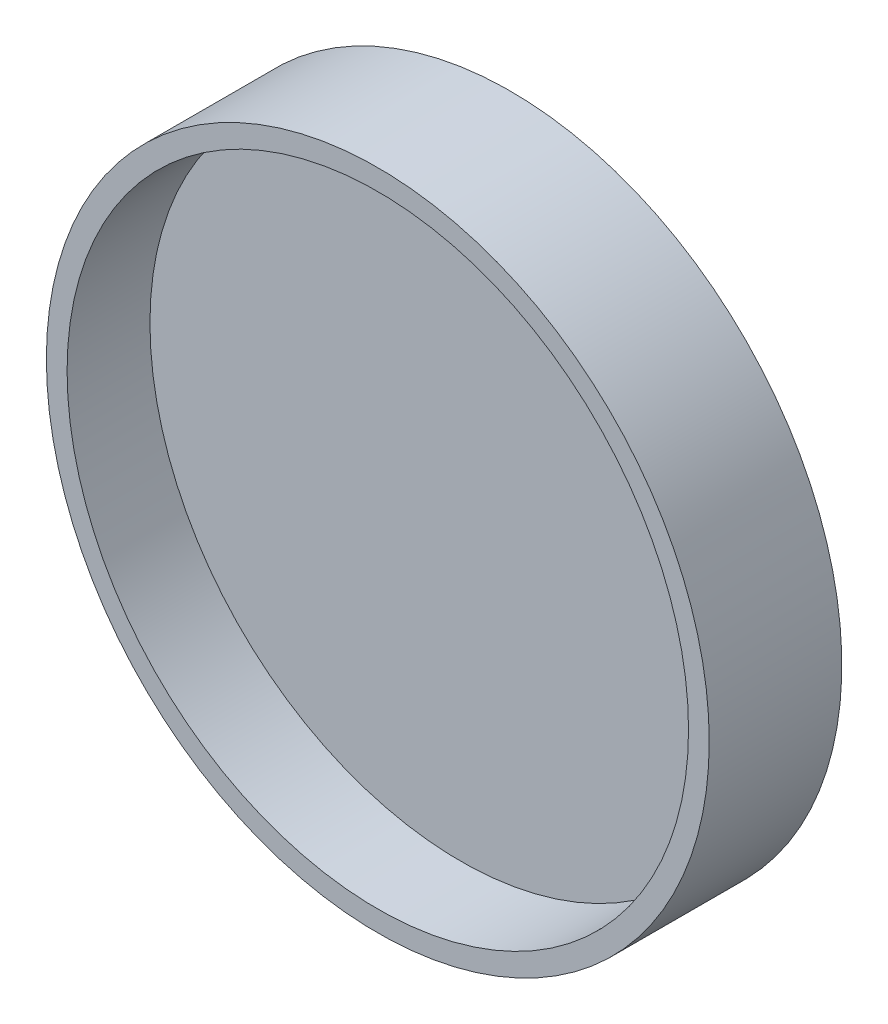
ISO-10303-21;
HEADER;
FILE_DESCRIPTION(('STEP AP214'),'2;1');
FILE_NAME('part.step','',(''),(''),'','','');
FILE_SCHEMA(('AUTOMOTIVE_DESIGN { 1 0 10303 214 1 1 1 1 }'));
ENDSEC;
DATA;
#1=APPLICATION_CONTEXT('core data for automotive mechanical design processes');
#2=APPLICATION_PROTOCOL_DEFINITION('international standard','automotive_design',2000,#1);
#3=PRODUCT_CONTEXT('',#1,'mechanical');
#4=PRODUCT('Part','Part','',(#3));
#5=PRODUCT_RELATED_PRODUCT_CATEGORY('part','',(#4));
#6=PRODUCT_DEFINITION_FORMATION('','',#4);
#7=PRODUCT_DEFINITION_CONTEXT('part definition',#1,'design');
#8=PRODUCT_DEFINITION('design','',#6,#7);
#9=PRODUCT_DEFINITION_SHAPE('','',#8);
#10=(LENGTH_UNIT() NAMED_UNIT(*) SI_UNIT(.MILLI.,.METRE.));
#11=(NAMED_UNIT(*) PLANE_ANGLE_UNIT() SI_UNIT($,.RADIAN.));
#12=(NAMED_UNIT(*) SI_UNIT($,.STERADIAN.) SOLID_ANGLE_UNIT());
#13=UNCERTAINTY_MEASURE_WITH_UNIT(LENGTH_MEASURE(1.E-05),#10,'distance_accuracy_value','');
#14=(GEOMETRIC_REPRESENTATION_CONTEXT(3) GLOBAL_UNCERTAINTY_ASSIGNED_CONTEXT((#13)) GLOBAL_UNIT_ASSIGNED_CONTEXT((#10,
#11,#12)) REPRESENTATION_CONTEXT('',''));
#15=CARTESIAN_POINT('',(0.,0.,0.));
#16=DIRECTION('',(0.,0.,1.));
#17=DIRECTION('',(1.,0.,0.));
#18=AXIS2_PLACEMENT_3D('',#15,#16,#17);
#19=CARTESIAN_POINT('',(0.,0.,-22.));
#20=DIRECTION('',(0.,0.,-1.));
#21=DIRECTION('',(-1.,0.,0.));
#22=AXIS2_PLACEMENT_3D('',#19,#20,#21);
#23=PLANE('',#22);
#24=CARTESIAN_POINT('',(0.,0.,-22.));
#25=DIRECTION('',(0.,0.,-1.));
#26=DIRECTION('',(-1.,0.,0.));
#27=AXIS2_PLACEMENT_3D('',#24,#25,#26);
#28=CIRCLE('',#27,13.9951171939745);
#29=CARTESIAN_POINT('',(-13.9951171939745,0.,-22.));
#30=VERTEX_POINT('',#29);
#31=EDGE_CURVE('E93',#30,#30,#28,.T.);
#32=ORIENTED_EDGE('',*,*,#31,.F.);
#33=EDGE_LOOP('',(#32));
#34=FACE_BOUND('',#33,.T.);
#35=CARTESIAN_POINT('',(0.,0.,-22.));
#36=DIRECTION('',(0.,0.,-1.));
#37=DIRECTION('',(-1.,0.,0.));
#38=AXIS2_PLACEMENT_3D('',#35,#36,#37);
#39=CIRCLE('',#38,34.425);
#40=CARTESIAN_POINT('',(-34.425,0.,-22.));
#41=VERTEX_POINT('',#40);
#42=EDGE_CURVE('E255',#41,#41,#39,.T.);
#43=ORIENTED_EDGE('',*,*,#42,.T.);
#44=EDGE_LOOP('',(#43));
#45=FACE_BOUND('',#44,.T.);
#46=ADVANCED_FACE('F54',(#34,#45),#23,.T.);
#47=CARTESIAN_POINT('',(0.,0.,-22.));
#48=DIRECTION('',(0.,0.,-1.));
#49=DIRECTION('',(-1.,0.,0.));
#50=AXIS2_PLACEMENT_3D('',#47,#48,#49);
#51=CONICAL_SURFACE('',#50,13.9951171939745,1.0471975511966);
#52=CARTESIAN_POINT('',(0.,0.,-20.04));
#53=DIRECTION('',(0.,0.,-1.));
#54=DIRECTION('',(-1.,0.,0.));
#55=AXIS2_PLACEMENT_3D('',#52,#53,#54);
#56=CIRCLE('',#55,10.6002976111395);
#57=CARTESIAN_POINT('',(-10.6002976111395,0.,-20.04));
#58=VERTEX_POINT('',#57);
#59=EDGE_CURVE('E83',#58,#58,#56,.T.);
#60=ORIENTED_EDGE('',*,*,#59,.F.);
#61=EDGE_LOOP('',(#60));
#62=FACE_BOUND('',#61,.T.);
#63=ORIENTED_EDGE('',*,*,#31,.T.);
#64=EDGE_LOOP('',(#63));
#65=FACE_BOUND('',#64,.T.);
#66=ADVANCED_FACE('F128',(#62,#65),#51,.F.);
#67=CARTESIAN_POINT('',(0.,0.,-20.04));
#68=DIRECTION('',(0.,0.,-1.));
#69=DIRECTION('',(-1.,0.,0.));
#70=AXIS2_PLACEMENT_3D('',#67,#68,#69);
#71=CONICAL_SURFACE('',#70,10.6002976111395,0.5235987755983);
#72=CARTESIAN_POINT('',(0.,0.,-10.3399999999999));
#73=DIRECTION('',(0.,0.,-1.));
#74=DIRECTION('',(-1.,0.,0.));
#75=AXIS2_PLACEMENT_3D('',#72,#73,#74);
#76=CIRCLE('',#75,5.);
#77=CARTESIAN_POINT('',(-5.,0.,-10.3399999999999));
#78=VERTEX_POINT('',#77);
#79=EDGE_CURVE('E76',#78,#78,#76,.T.);
#80=ORIENTED_EDGE('',*,*,#79,.F.);
#81=EDGE_LOOP('',(#80));
#82=FACE_BOUND('',#81,.T.);
#83=ORIENTED_EDGE('',*,*,#59,.T.);
#84=EDGE_LOOP('',(#83));
#85=FACE_BOUND('',#84,.T.);
#86=ADVANCED_FACE('F134',(#82,#85),#71,.F.);
#87=CARTESIAN_POINT('',(0.,0.,0.));
#88=DIRECTION('',(0.,0.,-1.));
#89=DIRECTION('',(-1.,0.,0.));
#90=AXIS2_PLACEMENT_3D('',#87,#88,#89);
#91=CYLINDRICAL_SURFACE('',#90,5.);
#92=CARTESIAN_POINT('',(0.,0.,2.46000000000011));
#93=DIRECTION('',(0.,0.,-1.));
#94=DIRECTION('',(-1.,0.,0.));
#95=AXIS2_PLACEMENT_3D('',#92,#93,#94);
#96=CIRCLE('',#95,5.);
#97=CARTESIAN_POINT('',(-5.,0.,2.46000000000011));
#98=VERTEX_POINT('',#97);
#99=EDGE_CURVE('E73',#98,#98,#96,.T.);
#100=ORIENTED_EDGE('',*,*,#99,.F.);
#101=EDGE_LOOP('',(#100));
#102=FACE_BOUND('',#101,.T.);
#103=ORIENTED_EDGE('',*,*,#79,.T.);
#104=EDGE_LOOP('',(#103));
#105=FACE_BOUND('',#104,.T.);
#106=ADVANCED_FACE('F69',(#102,#105),#91,.F.);
#107=CARTESIAN_POINT('',(0.,0.,2.46000000000011));
#108=DIRECTION('',(0.,0.,-1.));
#109=DIRECTION('',(-1.,0.,0.));
#110=AXIS2_PLACEMENT_3D('',#107,#108,#109);
#111=CONICAL_SURFACE('',#110,5.,0.785398163397438);
#112=CARTESIAN_POINT('',(0.,0.,7.46000000000015));
#113=VERTEX_POINT('',#112);
#114=VERTEX_LOOP('',#113);
#115=FACE_BOUND('',#114,.T.);
#116=ORIENTED_EDGE('',*,*,#99,.T.);
#117=EDGE_LOOP('',(#116));
#118=FACE_BOUND('',#117,.T.);
#119=ADVANCED_FACE('F65',(#115,#118),#111,.F.);
#120=CARTESIAN_POINT('',(0.,0.,-2.));
#121=DIRECTION('',(0.,0.,-1.));
#122=DIRECTION('',(-1.,0.,0.));
#123=AXIS2_PLACEMENT_3D('',#120,#121,#122);
#124=PLANE('',#123);
#125=CARTESIAN_POINT('',(0.,0.,-2.));
#126=DIRECTION('',(0.,0.,-1.));
#127=DIRECTION('',(-1.,0.,0.));
#128=AXIS2_PLACEMENT_3D('',#125,#126,#127);
#129=CIRCLE('',#128,34.425);
#130=CARTESIAN_POINT('',(-34.425,0.,-2.));
#131=VERTEX_POINT('',#130);
#132=EDGE_CURVE('E86',#131,#131,#129,.T.);
#133=ORIENTED_EDGE('',*,*,#132,.F.);
#134=EDGE_LOOP('',(#133));
#135=FACE_BOUND('',#134,.T.);
#136=CARTESIAN_POINT('',(0.,0.,-2.));
#137=DIRECTION('',(0.,0.,-1.));
#138=DIRECTION('',(-1.,0.,0.));
#139=AXIS2_PLACEMENT_3D('',#136,#137,#138);
#140=CIRCLE('',#139,80.);
#141=CARTESIAN_POINT('',(-80.,0.,-2.));
#142=VERTEX_POINT('',#141);
#143=EDGE_CURVE('E77',#142,#142,#140,.T.);
#144=ORIENTED_EDGE('',*,*,#143,.T.);
#145=EDGE_LOOP('',(#144));
#146=FACE_BOUND('',#145,.T.);
#147=ADVANCED_FACE('F68',(#135,#146),#124,.T.);
#148=CARTESIAN_POINT('',(0.,0.,-2.));
#149=DIRECTION('',(0.,0.,-1.));
#150=DIRECTION('',(-1.,0.,0.));
#151=AXIS2_PLACEMENT_3D('',#148,#149,#150);
#152=CYLINDRICAL_SURFACE('',#151,34.425);
#153=ORIENTED_EDGE('',*,*,#132,.T.);
#154=EDGE_LOOP('',(#153));
#155=FACE_BOUND('',#154,.T.);
#156=ORIENTED_EDGE('',*,*,#42,.F.);
#157=EDGE_LOOP('',(#156));
#158=FACE_BOUND('',#157,.T.);
#159=ADVANCED_FACE('F117',(#155,#158),#152,.T.);
#160=CARTESIAN_POINT('',(0.,0.,10.));
#161=DIRECTION('',(0.,0.,1.));
#162=DIRECTION('',(1.,0.,0.));
#163=AXIS2_PLACEMENT_3D('',#160,#161,#162);
#164=PLANE('',#163);
#165=CARTESIAN_POINT('',(0.,0.,10.));
#166=DIRECTION('',(0.,0.,1.));
#167=DIRECTION('',(1.,0.,0.));
#168=AXIS2_PLACEMENT_3D('',#165,#166,#167);
#169=CIRCLE('',#168,75.);
#170=CARTESIAN_POINT('',(75.,0.,10.));
#171=VERTEX_POINT('',#170);
#172=EDGE_CURVE('E62',#171,#171,#169,.T.);
#173=ORIENTED_EDGE('',*,*,#172,.T.);
#174=EDGE_LOOP('',(#173));
#175=FACE_BOUND('',#174,.T.);
#176=ADVANCED_FACE('F123',(#175),#164,.T.);
#177=CARTESIAN_POINT('',(0.,0.,10.));
#178=DIRECTION('',(0.,0.,1.));
#179=DIRECTION('',(1.,0.,0.));
#180=AXIS2_PLACEMENT_3D('',#177,#178,#179);
#181=CYLINDRICAL_SURFACE('',#180,75.);
#182=ORIENTED_EDGE('',*,*,#172,.F.);
#183=EDGE_LOOP('',(#182));
#184=FACE_BOUND('',#183,.T.);
#185=CARTESIAN_POINT('',(0.,0.,30.));
#186=DIRECTION('',(0.,0.,1.));
#187=DIRECTION('',(1.,0.,0.));
#188=AXIS2_PLACEMENT_3D('',#185,#186,#187);
#189=CIRCLE('',#188,75.);
#190=CARTESIAN_POINT('',(75.,0.,30.));
#191=VERTEX_POINT('',#190);
#192=EDGE_CURVE('E97',#191,#191,#189,.T.);
#193=ORIENTED_EDGE('',*,*,#192,.T.);
#194=EDGE_LOOP('',(#193));
#195=FACE_BOUND('',#194,.T.);
#196=ADVANCED_FACE('F105',(#184,#195),#181,.F.);
#197=CARTESIAN_POINT('',(0.,0.,30.));
#198=DIRECTION('',(0.,0.,1.));
#199=DIRECTION('',(1.,0.,0.));
#200=AXIS2_PLACEMENT_3D('',#197,#198,#199);
#201=PLANE('',#200);
#202=ORIENTED_EDGE('',*,*,#192,.F.);
#203=EDGE_LOOP('',(#202));
#204=FACE_BOUND('',#203,.T.);
#205=CARTESIAN_POINT('',(0.,0.,30.));
#206=DIRECTION('',(0.,0.,1.));
#207=DIRECTION('',(1.,0.,0.));
#208=AXIS2_PLACEMENT_3D('',#205,#206,#207);
#209=CIRCLE('',#208,80.);
#210=CARTESIAN_POINT('',(80.,0.,30.));
#211=VERTEX_POINT('',#210);
#212=EDGE_CURVE('E11',#211,#211,#209,.T.);
#213=ORIENTED_EDGE('',*,*,#212,.T.);
#214=EDGE_LOOP('',(#213));
#215=FACE_BOUND('',#214,.T.);
#216=ADVANCED_FACE('F107',(#204,#215),#201,.T.);
#217=CARTESIAN_POINT('',(0.,0.,30.));
#218=DIRECTION('',(0.,0.,-1.));
#219=DIRECTION('',(-1.,0.,0.));
#220=AXIS2_PLACEMENT_3D('',#217,#218,#219);
#221=CYLINDRICAL_SURFACE('',#220,80.);
#222=ORIENTED_EDGE('',*,*,#212,.F.);
#223=EDGE_LOOP('',(#222));
#224=FACE_BOUND('',#223,.T.);
#225=ORIENTED_EDGE('',*,*,#143,.F.);
#226=EDGE_LOOP('',(#225));
#227=FACE_BOUND('',#226,.T.);
#228=ADVANCED_FACE('F56',(#224,#227),#221,.T.);
#229=CLOSED_SHELL('',(#46,#66,#86,#106,#119,#147,#159,#176,#196,#216,#228));
#230=MANIFOLD_SOLID_BREP('B2',#229);
#231=ADVANCED_BREP_SHAPE_REPRESENTATION('',(#18,#230),#14);
#232=SHAPE_DEFINITION_REPRESENTATION(#9,#231);
ENDSEC;
END-ISO-10303-21;
